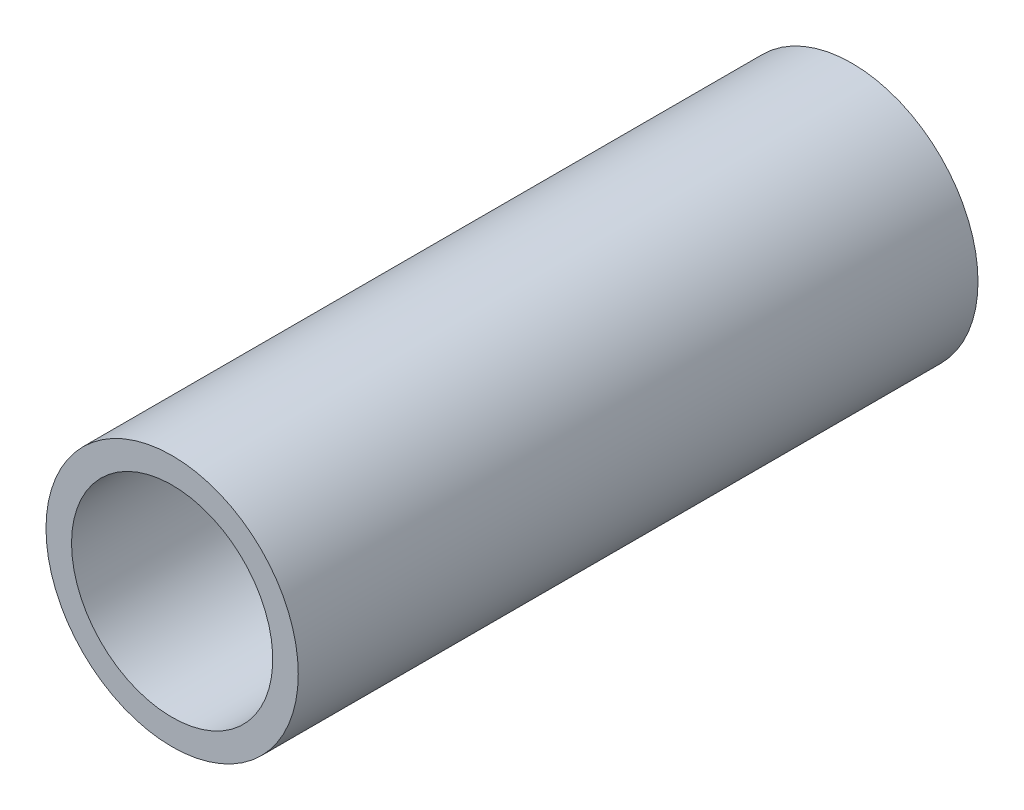
ISO-10303-21;
HEADER;
FILE_DESCRIPTION(('STEP AP214'),'2;1');
FILE_NAME('part.step','',(''),(''),'','','');
FILE_SCHEMA(('AUTOMOTIVE_DESIGN { 1 0 10303 214 1 1 1 1 }'));
ENDSEC;
DATA;
#1=APPLICATION_CONTEXT('core data for automotive mechanical design processes');
#2=APPLICATION_PROTOCOL_DEFINITION('international standard','automotive_design',2000,#1);
#3=PRODUCT_CONTEXT('',#1,'mechanical');
#4=PRODUCT('Part','Part','',(#3));
#5=PRODUCT_RELATED_PRODUCT_CATEGORY('part','',(#4));
#6=PRODUCT_DEFINITION_FORMATION('','',#4);
#7=PRODUCT_DEFINITION_CONTEXT('part definition',#1,'design');
#8=PRODUCT_DEFINITION('design','',#6,#7);
#9=PRODUCT_DEFINITION_SHAPE('','',#8);
#10=(LENGTH_UNIT() NAMED_UNIT(*) SI_UNIT(.MILLI.,.METRE.));
#11=(NAMED_UNIT(*) PLANE_ANGLE_UNIT() SI_UNIT($,.RADIAN.));
#12=(NAMED_UNIT(*) SI_UNIT($,.STERADIAN.) SOLID_ANGLE_UNIT());
#13=UNCERTAINTY_MEASURE_WITH_UNIT(LENGTH_MEASURE(1.E-05),#10,'distance_accuracy_value','');
#14=(GEOMETRIC_REPRESENTATION_CONTEXT(3) GLOBAL_UNCERTAINTY_ASSIGNED_CONTEXT((#13)) GLOBAL_UNIT_ASSIGNED_CONTEXT((#10,
#11,#12)) REPRESENTATION_CONTEXT('',''));
#15=CARTESIAN_POINT('',(0.,0.,0.));
#16=DIRECTION('',(0.,0.,1.));
#17=DIRECTION('',(1.,0.,0.));
#18=AXIS2_PLACEMENT_3D('',#15,#16,#17);
#19=CARTESIAN_POINT('',(0.,0.,45.));
#20=DIRECTION('',(0.,0.,1.));
#21=DIRECTION('',(1.,0.,0.));
#22=AXIS2_PLACEMENT_3D('',#19,#20,#21);
#23=PLANE('',#22);
#24=CARTESIAN_POINT('',(0.,0.,45.));
#25=DIRECTION('',(0.,0.,1.));
#26=DIRECTION('',(1.,0.,0.));
#27=AXIS2_PLACEMENT_3D('',#24,#25,#26);
#28=CIRCLE('',#27,16.7005);
#29=CARTESIAN_POINT('',(-16.7005,0.,45.));
#30=VERTEX_POINT('',#29);
#31=EDGE_CURVE('E11',#30,#30,#28,.T.);
#32=ORIENTED_EDGE('',*,*,#31,.T.);
#33=EDGE_LOOP('',(#32));
#34=FACE_BOUND('',#33,.T.);
#35=CARTESIAN_POINT('',(0.,0.,45.));
#36=DIRECTION('',(0.,0.,1.));
#37=DIRECTION('',(1.,0.,0.));
#38=AXIS2_PLACEMENT_3D('',#35,#36,#37);
#39=CIRCLE('',#38,13.3223);
#40=CARTESIAN_POINT('',(-13.3223,0.,45.));
#41=VERTEX_POINT('',#40);
#42=EDGE_CURVE('E56',#41,#41,#39,.T.);
#43=ORIENTED_EDGE('',*,*,#42,.F.);
#44=EDGE_LOOP('',(#43));
#45=FACE_BOUND('',#44,.T.);
#46=ADVANCED_FACE('F43',(#34,#45),#23,.T.);
#47=CARTESIAN_POINT('',(0.,0.,-45.));
#48=DIRECTION('',(0.,0.,1.));
#49=DIRECTION('',(1.,0.,0.));
#50=AXIS2_PLACEMENT_3D('',#47,#48,#49);
#51=PLANE('',#50);
#52=CARTESIAN_POINT('',(0.,0.,-45.));
#53=DIRECTION('',(0.,0.,1.));
#54=DIRECTION('',(1.,0.,0.));
#55=AXIS2_PLACEMENT_3D('',#52,#53,#54);
#56=CIRCLE('',#55,16.7005);
#57=CARTESIAN_POINT('',(-16.7005,0.,-45.));
#58=VERTEX_POINT('',#57);
#59=EDGE_CURVE('E47',#58,#58,#56,.T.);
#60=ORIENTED_EDGE('',*,*,#59,.F.);
#61=EDGE_LOOP('',(#60));
#62=FACE_BOUND('',#61,.T.);
#63=CARTESIAN_POINT('',(0.,0.,-45.));
#64=DIRECTION('',(0.,0.,1.));
#65=DIRECTION('',(1.,0.,0.));
#66=AXIS2_PLACEMENT_3D('',#63,#64,#65);
#67=CIRCLE('',#66,13.3223);
#68=CARTESIAN_POINT('',(-13.3223,0.,-45.));
#69=VERTEX_POINT('',#68);
#70=EDGE_CURVE('E58',#69,#69,#67,.T.);
#71=ORIENTED_EDGE('',*,*,#70,.T.);
#72=EDGE_LOOP('',(#71));
#73=FACE_BOUND('',#72,.T.);
#74=ADVANCED_FACE('F70',(#62,#73),#51,.F.);
#75=CARTESIAN_POINT('',(0.,0.,45.));
#76=DIRECTION('',(0.,0.,-1.));
#77=DIRECTION('',(-1.,0.,0.));
#78=AXIS2_PLACEMENT_3D('',#75,#76,#77);
#79=CYLINDRICAL_SURFACE('',#78,16.7005);
#80=CARTESIAN_POINT('',(-16.7005,0.,45.));
#81=CARTESIAN_POINT('',(-16.7005,0.,44.0625));
#82=CARTESIAN_POINT('',(-16.7005,0.,43.125));
#83=CARTESIAN_POINT('',(-16.7005,0.,41.25));
#84=CARTESIAN_POINT('',(-16.7005,0.,40.3125));
#85=CARTESIAN_POINT('',(-16.7005,0.,38.4375));
#86=CARTESIAN_POINT('',(-16.7005,0.,37.5));
#87=CARTESIAN_POINT('',(-16.7005,0.,35.625));
#88=CARTESIAN_POINT('',(-16.7005,0.,34.6875));
#89=CARTESIAN_POINT('',(-16.7005,0.,32.8125));
#90=CARTESIAN_POINT('',(-16.7005,0.,31.875));
#91=CARTESIAN_POINT('',(-16.7005,0.,30.));
#92=CARTESIAN_POINT('',(-16.7005,0.,29.0625));
#93=CARTESIAN_POINT('',(-16.7005,0.,27.1875));
#94=CARTESIAN_POINT('',(-16.7005,0.,26.25));
#95=CARTESIAN_POINT('',(-16.7005,0.,24.375));
#96=CARTESIAN_POINT('',(-16.7005,0.,23.4375));
#97=CARTESIAN_POINT('',(-16.7005,0.,21.5625));
#98=CARTESIAN_POINT('',(-16.7005,0.,20.625));
#99=CARTESIAN_POINT('',(-16.7005,0.,18.75));
#100=CARTESIAN_POINT('',(-16.7005,0.,17.8125));
#101=CARTESIAN_POINT('',(-16.7005,0.,15.9375));
#102=CARTESIAN_POINT('',(-16.7005,0.,15.));
#103=CARTESIAN_POINT('',(-16.7005,0.,13.125));
#104=CARTESIAN_POINT('',(-16.7005,0.,12.1875));
#105=CARTESIAN_POINT('',(-16.7005,0.,10.3125));
#106=CARTESIAN_POINT('',(-16.7005,0.,9.37499999999999));
#107=CARTESIAN_POINT('',(-16.7005,0.,7.49999999999999));
#108=CARTESIAN_POINT('',(-16.7005,0.,6.56249999999999));
#109=CARTESIAN_POINT('',(-16.7005,0.,4.68749999999999));
#110=CARTESIAN_POINT('',(-16.7005,0.,3.74999999999999));
#111=CARTESIAN_POINT('',(-16.7005,0.,1.87499999999999));
#112=CARTESIAN_POINT('',(-16.7005,0.,0.937499999999987));
#113=CARTESIAN_POINT('',(-16.7005,0.,-0.937500000000015));
#114=CARTESIAN_POINT('',(-16.7005,0.,-1.87500000000002));
#115=CARTESIAN_POINT('',(-16.7005,0.,-3.75000000000002));
#116=CARTESIAN_POINT('',(-16.7005,0.,-4.68750000000002));
#117=CARTESIAN_POINT('',(-16.7005,0.,-6.56250000000002));
#118=CARTESIAN_POINT('',(-16.7005,0.,-7.50000000000002));
#119=CARTESIAN_POINT('',(-16.7005,0.,-9.37500000000002));
#120=CARTESIAN_POINT('',(-16.7005,0.,-10.3125));
#121=CARTESIAN_POINT('',(-16.7005,0.,-12.1875));
#122=CARTESIAN_POINT('',(-16.7005,0.,-13.125));
#123=CARTESIAN_POINT('',(-16.7005,0.,-15.));
#124=CARTESIAN_POINT('',(-16.7005,0.,-15.9375));
#125=CARTESIAN_POINT('',(-16.7005,0.,-17.8125));
#126=CARTESIAN_POINT('',(-16.7005,0.,-18.75));
#127=CARTESIAN_POINT('',(-16.7005,0.,-20.625));
#128=CARTESIAN_POINT('',(-16.7005,0.,-21.5625));
#129=CARTESIAN_POINT('',(-16.7005,0.,-23.4375));
#130=CARTESIAN_POINT('',(-16.7005,0.,-24.375));
#131=CARTESIAN_POINT('',(-16.7005,0.,-26.25));
#132=CARTESIAN_POINT('',(-16.7005,0.,-27.1875));
#133=CARTESIAN_POINT('',(-16.7005,0.,-29.0625));
#134=CARTESIAN_POINT('',(-16.7005,0.,-30.));
#135=CARTESIAN_POINT('',(-16.7005,0.,-31.875));
#136=CARTESIAN_POINT('',(-16.7005,0.,-32.8125));
#137=CARTESIAN_POINT('',(-16.7005,0.,-34.6875));
#138=CARTESIAN_POINT('',(-16.7005,0.,-35.625));
#139=CARTESIAN_POINT('',(-16.7005,0.,-37.5));
#140=CARTESIAN_POINT('',(-16.7005,0.,-38.4375));
#141=CARTESIAN_POINT('',(-16.7005,0.,-40.3125));
#142=CARTESIAN_POINT('',(-16.7005,0.,-41.25));
#143=CARTESIAN_POINT('',(-16.7005,0.,-43.125));
#144=CARTESIAN_POINT('',(-16.7005,0.,-44.0625));
#145=CARTESIAN_POINT('',(-16.7005,0.,-45.));
#146=B_SPLINE_CURVE_WITH_KNOTS('',3,(#80,#81,#82,#83,#84,#85,#86,#87,#88,#89,#90,#91,#92,#93,
#94,#95,#96,#97,#98,#99,#100,#101,#102,#103,#104,#105,#106,#107,#108,#109,#110,#111,#112,#113,
#114,#115,#116,#117,#118,#119,#120,#121,#122,#123,#124,#125,#126,#127,#128,#129,#130,#131,#132,
#133,#134,#135,#136,#137,#138,#139,#140,#141,#142,#143,#144,#145),.UNSPECIFIED.,.F.,.F.,(4,2,2,
2,2,2,2,2,2,2,2,2,2,2,2,2,2,2,2,2,2,2,2,2,2,2,2,2,2,2,2,2,4),(0.,2.8125,5.625,8.43749999999999,
11.25,14.0625,16.875,19.6875,22.5,25.3125,28.125,30.9375,33.75,36.5625,39.375,42.1875,45.,
47.8125,50.625,53.4375,56.25,59.0625,61.875,64.6875,67.5,70.3125,73.125,75.9375,78.75,81.5625,
84.375,87.1875,90.),.UNSPECIFIED.);
#147=EDGE_CURVE('BSEAM45',#30,#58,#146,.T.);
#148=ORIENTED_EDGE('',*,*,#31,.F.);
#149=ORIENTED_EDGE('',*,*,#59,.T.);
#150=ORIENTED_EDGE('',*,*,#147,.T.);
#151=ORIENTED_EDGE('',*,*,#147,.F.);
#152=EDGE_LOOP('',(#148,#150,#149,#151));
#153=FACE_BOUND('',#152,.T.);
#154=ADVANCED_FACE('F45',(#153),#79,.T.);
#155=CARTESIAN_POINT('',(0.,0.,45.));
#156=DIRECTION('',(0.,0.,-1.));
#157=DIRECTION('',(-1.,0.,0.));
#158=AXIS2_PLACEMENT_3D('',#155,#156,#157);
#159=CYLINDRICAL_SURFACE('',#158,13.3223);
#160=CARTESIAN_POINT('',(-13.3223,0.,45.));
#161=CARTESIAN_POINT('',(-13.3223,0.,44.0625));
#162=CARTESIAN_POINT('',(-13.3223,0.,43.125));
#163=CARTESIAN_POINT('',(-13.3223,0.,41.25));
#164=CARTESIAN_POINT('',(-13.3223,0.,40.3125));
#165=CARTESIAN_POINT('',(-13.3223,0.,38.4375));
#166=CARTESIAN_POINT('',(-13.3223,0.,37.5));
#167=CARTESIAN_POINT('',(-13.3223,0.,35.625));
#168=CARTESIAN_POINT('',(-13.3223,0.,34.6875));
#169=CARTESIAN_POINT('',(-13.3223,0.,32.8125));
#170=CARTESIAN_POINT('',(-13.3223,0.,31.875));
#171=CARTESIAN_POINT('',(-13.3223,0.,30.));
#172=CARTESIAN_POINT('',(-13.3223,0.,29.0625));
#173=CARTESIAN_POINT('',(-13.3223,0.,27.1875));
#174=CARTESIAN_POINT('',(-13.3223,0.,26.25));
#175=CARTESIAN_POINT('',(-13.3223,0.,24.375));
#176=CARTESIAN_POINT('',(-13.3223,0.,23.4375));
#177=CARTESIAN_POINT('',(-13.3223,0.,21.5625));
#178=CARTESIAN_POINT('',(-13.3223,0.,20.625));
#179=CARTESIAN_POINT('',(-13.3223,0.,18.75));
#180=CARTESIAN_POINT('',(-13.3223,0.,17.8125));
#181=CARTESIAN_POINT('',(-13.3223,0.,15.9375));
#182=CARTESIAN_POINT('',(-13.3223,0.,15.));
#183=CARTESIAN_POINT('',(-13.3223,0.,13.125));
#184=CARTESIAN_POINT('',(-13.3223,0.,12.1875));
#185=CARTESIAN_POINT('',(-13.3223,0.,10.3125));
#186=CARTESIAN_POINT('',(-13.3223,0.,9.37499999999999));
#187=CARTESIAN_POINT('',(-13.3223,0.,7.49999999999999));
#188=CARTESIAN_POINT('',(-13.3223,0.,6.56249999999999));
#189=CARTESIAN_POINT('',(-13.3223,0.,4.68749999999999));
#190=CARTESIAN_POINT('',(-13.3223,0.,3.74999999999999));
#191=CARTESIAN_POINT('',(-13.3223,0.,1.87499999999999));
#192=CARTESIAN_POINT('',(-13.3223,0.,0.937499999999987));
#193=CARTESIAN_POINT('',(-13.3223,0.,-0.937500000000015));
#194=CARTESIAN_POINT('',(-13.3223,0.,-1.87500000000002));
#195=CARTESIAN_POINT('',(-13.3223,0.,-3.75000000000002));
#196=CARTESIAN_POINT('',(-13.3223,0.,-4.68750000000002));
#197=CARTESIAN_POINT('',(-13.3223,0.,-6.56250000000002));
#198=CARTESIAN_POINT('',(-13.3223,0.,-7.50000000000002));
#199=CARTESIAN_POINT('',(-13.3223,0.,-9.37500000000002));
#200=CARTESIAN_POINT('',(-13.3223,0.,-10.3125));
#201=CARTESIAN_POINT('',(-13.3223,0.,-12.1875));
#202=CARTESIAN_POINT('',(-13.3223,0.,-13.125));
#203=CARTESIAN_POINT('',(-13.3223,0.,-15.));
#204=CARTESIAN_POINT('',(-13.3223,0.,-15.9375));
#205=CARTESIAN_POINT('',(-13.3223,0.,-17.8125));
#206=CARTESIAN_POINT('',(-13.3223,0.,-18.75));
#207=CARTESIAN_POINT('',(-13.3223,0.,-20.625));
#208=CARTESIAN_POINT('',(-13.3223,0.,-21.5625));
#209=CARTESIAN_POINT('',(-13.3223,0.,-23.4375));
#210=CARTESIAN_POINT('',(-13.3223,0.,-24.375));
#211=CARTESIAN_POINT('',(-13.3223,0.,-26.25));
#212=CARTESIAN_POINT('',(-13.3223,0.,-27.1875));
#213=CARTESIAN_POINT('',(-13.3223,0.,-29.0625));
#214=CARTESIAN_POINT('',(-13.3223,0.,-30.));
#215=CARTESIAN_POINT('',(-13.3223,0.,-31.875));
#216=CARTESIAN_POINT('',(-13.3223,0.,-32.8125));
#217=CARTESIAN_POINT('',(-13.3223,0.,-34.6875));
#218=CARTESIAN_POINT('',(-13.3223,0.,-35.625));
#219=CARTESIAN_POINT('',(-13.3223,0.,-37.5));
#220=CARTESIAN_POINT('',(-13.3223,0.,-38.4375));
#221=CARTESIAN_POINT('',(-13.3223,0.,-40.3125));
#222=CARTESIAN_POINT('',(-13.3223,0.,-41.25));
#223=CARTESIAN_POINT('',(-13.3223,0.,-43.125));
#224=CARTESIAN_POINT('',(-13.3223,0.,-44.0625));
#225=CARTESIAN_POINT('',(-13.3223,0.,-45.));
#226=B_SPLINE_CURVE_WITH_KNOTS('',3,(#160,#161,#162,#163,#164,#165,#166,#167,#168,#169,#170,
#171,#172,#173,#174,#175,#176,#177,#178,#179,#180,#181,#182,#183,#184,#185,#186,#187,#188,#189,
#190,#191,#192,#193,#194,#195,#196,#197,#198,#199,#200,#201,#202,#203,#204,#205,#206,#207,#208,
#209,#210,#211,#212,#213,#214,#215,#216,#217,#218,#219,#220,#221,#222,#223,#224,#225),
.UNSPECIFIED.,.F.,.F.,(4,2,2,2,2,2,2,2,2,2,2,2,2,2,2,2,2,2,2,2,2,2,2,2,2,2,2,2,2,2,2,2,4),(0.,
2.8125,5.625,8.43749999999999,11.25,14.0625,16.875,19.6875,22.5,25.3125,28.125,30.9375,33.75,
36.5625,39.375,42.1875,45.,47.8125,50.625,53.4375,56.25,59.0625,61.875,64.6875,67.5,70.3125,
73.125,75.9375,78.75,81.5625,84.375,87.1875,90.),.UNSPECIFIED.);
#227=EDGE_CURVE('BSEAM66',#41,#69,#226,.T.);
#228=ORIENTED_EDGE('',*,*,#42,.T.);
#229=ORIENTED_EDGE('',*,*,#70,.F.);
#230=ORIENTED_EDGE('',*,*,#227,.T.);
#231=ORIENTED_EDGE('',*,*,#227,.F.);
#232=EDGE_LOOP('',(#228,#230,#229,#231));
#233=FACE_BOUND('',#232,.T.);
#234=ADVANCED_FACE('F66',(#233),#159,.F.);
#235=CLOSED_SHELL('',(#46,#74,#154,#234));
#236=MANIFOLD_SOLID_BREP('B2',#235);
#237=ADVANCED_BREP_SHAPE_REPRESENTATION('',(#18,#236),#14);
#238=SHAPE_DEFINITION_REPRESENTATION(#9,#237);
ENDSEC;
END-ISO-10303-21;
